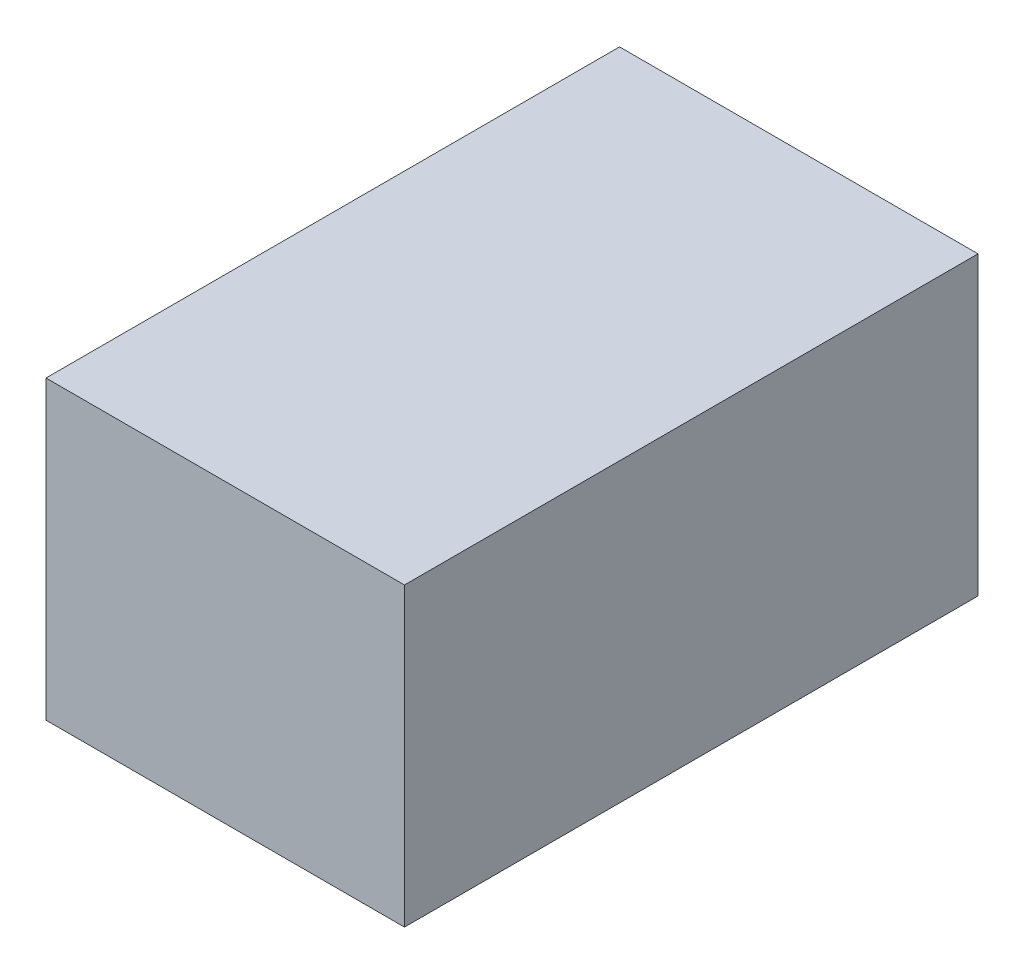
ISO-10303-21;
HEADER;
FILE_DESCRIPTION(('STEP AP214'),'2;1');
FILE_NAME('part.step','',(''),(''),'','','');
FILE_SCHEMA(('AUTOMOTIVE_DESIGN { 1 0 10303 214 1 1 1 1 }'));
ENDSEC;
DATA;
#1=APPLICATION_CONTEXT('core data for automotive mechanical design processes');
#2=APPLICATION_PROTOCOL_DEFINITION('international standard','automotive_design',2000,#1);
#3=PRODUCT_CONTEXT('',#1,'mechanical');
#4=PRODUCT('Part','Part','',(#3));
#5=PRODUCT_RELATED_PRODUCT_CATEGORY('part','',(#4));
#6=PRODUCT_DEFINITION_FORMATION('','',#4);
#7=PRODUCT_DEFINITION_CONTEXT('part definition',#1,'design');
#8=PRODUCT_DEFINITION('design','',#6,#7);
#9=PRODUCT_DEFINITION_SHAPE('','',#8);
#10=(LENGTH_UNIT() NAMED_UNIT(*) SI_UNIT(.MILLI.,.METRE.));
#11=(NAMED_UNIT(*) PLANE_ANGLE_UNIT() SI_UNIT($,.RADIAN.));
#12=(NAMED_UNIT(*) SI_UNIT($,.STERADIAN.) SOLID_ANGLE_UNIT());
#13=UNCERTAINTY_MEASURE_WITH_UNIT(LENGTH_MEASURE(1.E-05),#10,'distance_accuracy_value','');
#14=(GEOMETRIC_REPRESENTATION_CONTEXT(3) GLOBAL_UNCERTAINTY_ASSIGNED_CONTEXT((#13)) GLOBAL_UNIT_ASSIGNED_CONTEXT((#10,
#11,#12)) REPRESENTATION_CONTEXT('',''));
#15=CARTESIAN_POINT('',(0.,0.,0.));
#16=DIRECTION('',(0.,0.,1.));
#17=DIRECTION('',(1.,0.,0.));
#18=AXIS2_PLACEMENT_3D('',#15,#16,#17);
#19=CARTESIAN_POINT('',(37.5,62.,-60.));
#20=DIRECTION('',(-1.,0.,0.));
#21=DIRECTION('',(0.,0.,1.));
#22=AXIS2_PLACEMENT_3D('',#19,#20,#21);
#23=PLANE('',#22);
#24=DIRECTION('',(0.,0.,-1.));
#25=VECTOR('',#24,1.);
#26=CARTESIAN_POINT('',(37.5,0.,-60.));
#27=LINE('',#26,#25);
#28=CARTESIAN_POINT('',(37.5,0.,60.));
#29=VERTEX_POINT('',#28);
#30=CARTESIAN_POINT('',(37.5,0.,-60.));
#31=VERTEX_POINT('',#30);
#32=EDGE_CURVE('E102',#29,#31,#27,.T.);
#33=ORIENTED_EDGE('',*,*,#32,.T.);
#34=DIRECTION('',(0.,-1.,0.));
#35=VECTOR('',#34,1.);
#36=CARTESIAN_POINT('',(37.5,62.,-60.));
#37=LINE('',#36,#35);
#38=CARTESIAN_POINT('',(37.5,62.,-60.));
#39=VERTEX_POINT('',#38);
#40=EDGE_CURVE('E11',#39,#31,#37,.T.);
#41=ORIENTED_EDGE('',*,*,#40,.F.);
#42=DIRECTION('',(0.,0.,-1.));
#43=VECTOR('',#42,1.);
#44=CARTESIAN_POINT('',(37.5,62.,-60.));
#45=LINE('',#44,#43);
#46=CARTESIAN_POINT('',(37.5,62.,60.));
#47=VERTEX_POINT('',#46);
#48=EDGE_CURVE('E90',#47,#39,#45,.T.);
#49=ORIENTED_EDGE('',*,*,#48,.F.);
#50=DIRECTION('',(0.,-1.,0.));
#51=VECTOR('',#50,1.);
#52=CARTESIAN_POINT('',(37.5,62.,60.));
#53=LINE('',#52,#51);
#54=EDGE_CURVE('E98',#47,#29,#53,.T.);
#55=ORIENTED_EDGE('',*,*,#54,.T.);
#56=EDGE_LOOP('',(#33,#41,#49,#55));
#57=FACE_BOUND('',#56,.T.);
#58=ADVANCED_FACE('F39',(#57),#23,.F.);
#59=CARTESIAN_POINT('',(-37.5,62.,-60.));
#60=DIRECTION('',(0.,0.,1.));
#61=DIRECTION('',(1.,0.,0.));
#62=AXIS2_PLACEMENT_3D('',#59,#60,#61);
#63=PLANE('',#62);
#64=DIRECTION('',(-1.,0.,0.));
#65=VECTOR('',#64,1.);
#66=CARTESIAN_POINT('',(-37.5,0.,-60.));
#67=LINE('',#66,#65);
#68=CARTESIAN_POINT('',(-37.5,0.,-60.));
#69=VERTEX_POINT('',#68);
#70=EDGE_CURVE('E94',#31,#69,#67,.T.);
#71=ORIENTED_EDGE('',*,*,#70,.T.);
#72=DIRECTION('',(0.,-1.,0.));
#73=VECTOR('',#72,1.);
#74=CARTESIAN_POINT('',(-37.5,62.,-60.));
#75=LINE('',#74,#73);
#76=CARTESIAN_POINT('',(-37.5,62.,-60.));
#77=VERTEX_POINT('',#76);
#78=EDGE_CURVE('E47',#77,#69,#75,.T.);
#79=ORIENTED_EDGE('',*,*,#78,.F.);
#80=DIRECTION('',(-1.,0.,0.));
#81=VECTOR('',#80,1.);
#82=CARTESIAN_POINT('',(-37.5,62.,-60.));
#83=LINE('',#82,#81);
#84=EDGE_CURVE('E85',#39,#77,#83,.T.);
#85=ORIENTED_EDGE('',*,*,#84,.F.);
#86=ORIENTED_EDGE('',*,*,#40,.T.);
#87=EDGE_LOOP('',(#71,#79,#85,#86));
#88=FACE_BOUND('',#87,.T.);
#89=ADVANCED_FACE('F93',(#88),#63,.F.);
#90=CARTESIAN_POINT('',(-37.5,62.,-60.));
#91=DIRECTION('',(1.,0.,0.));
#92=DIRECTION('',(0.,0.,-1.));
#93=AXIS2_PLACEMENT_3D('',#90,#91,#92);
#94=PLANE('',#93);
#95=DIRECTION('',(0.,0.,1.));
#96=VECTOR('',#95,1.);
#97=CARTESIAN_POINT('',(-37.5,0.,-60.));
#98=LINE('',#97,#96);
#99=CARTESIAN_POINT('',(-37.5,0.,60.));
#100=VERTEX_POINT('',#99);
#101=EDGE_CURVE('E72',#69,#100,#98,.T.);
#102=ORIENTED_EDGE('',*,*,#101,.T.);
#103=DIRECTION('',(0.,-1.,0.));
#104=VECTOR('',#103,1.);
#105=CARTESIAN_POINT('',(-37.5,62.,60.));
#106=LINE('',#105,#104);
#107=CARTESIAN_POINT('',(-37.5,62.,60.));
#108=VERTEX_POINT('',#107);
#109=EDGE_CURVE('E95',#108,#100,#106,.T.);
#110=ORIENTED_EDGE('',*,*,#109,.F.);
#111=DIRECTION('',(0.,0.,1.));
#112=VECTOR('',#111,1.);
#113=CARTESIAN_POINT('',(-37.5,62.,-60.));
#114=LINE('',#113,#112);
#115=EDGE_CURVE('E88',#77,#108,#114,.T.);
#116=ORIENTED_EDGE('',*,*,#115,.F.);
#117=ORIENTED_EDGE('',*,*,#78,.T.);
#118=EDGE_LOOP('',(#102,#110,#116,#117));
#119=FACE_BOUND('',#118,.T.);
#120=ADVANCED_FACE('F96',(#119),#94,.F.);
#121=CARTESIAN_POINT('',(-37.5,62.,60.));
#122=DIRECTION('',(0.,0.,-1.));
#123=DIRECTION('',(-1.,0.,0.));
#124=AXIS2_PLACEMENT_3D('',#121,#122,#123);
#125=PLANE('',#124);
#126=DIRECTION('',(1.,0.,0.));
#127=VECTOR('',#126,1.);
#128=CARTESIAN_POINT('',(-37.5,0.,60.));
#129=LINE('',#128,#127);
#130=EDGE_CURVE('E78',#100,#29,#129,.T.);
#131=ORIENTED_EDGE('',*,*,#130,.T.);
#132=ORIENTED_EDGE('',*,*,#54,.F.);
#133=DIRECTION('',(1.,0.,0.));
#134=VECTOR('',#133,1.);
#135=CARTESIAN_POINT('',(-37.5,62.,60.));
#136=LINE('',#135,#134);
#137=EDGE_CURVE('E55',#108,#47,#136,.T.);
#138=ORIENTED_EDGE('',*,*,#137,.F.);
#139=ORIENTED_EDGE('',*,*,#109,.T.);
#140=EDGE_LOOP('',(#131,#132,#138,#139));
#141=FACE_BOUND('',#140,.T.);
#142=ADVANCED_FACE('F109',(#141),#125,.F.);
#143=CARTESIAN_POINT('',(0.,62.,0.));
#144=DIRECTION('',(0.,1.,0.));
#145=DIRECTION('',(0.,0.,1.));
#146=AXIS2_PLACEMENT_3D('',#143,#144,#145);
#147=PLANE('',#146);
#148=ORIENTED_EDGE('',*,*,#48,.T.);
#149=ORIENTED_EDGE('',*,*,#84,.T.);
#150=ORIENTED_EDGE('',*,*,#115,.T.);
#151=ORIENTED_EDGE('',*,*,#137,.T.);
#152=EDGE_LOOP('',(#148,#149,#150,#151));
#153=FACE_BOUND('',#152,.T.);
#154=ADVANCED_FACE('F86',(#153),#147,.T.);
#155=CARTESIAN_POINT('',(0.,0.,0.));
#156=DIRECTION('',(0.,1.,0.));
#157=DIRECTION('',(0.,0.,1.));
#158=AXIS2_PLACEMENT_3D('',#155,#156,#157);
#159=PLANE('',#158);
#160=ORIENTED_EDGE('',*,*,#32,.F.);
#161=ORIENTED_EDGE('',*,*,#130,.F.);
#162=ORIENTED_EDGE('',*,*,#101,.F.);
#163=ORIENTED_EDGE('',*,*,#70,.F.);
#164=EDGE_LOOP('',(#160,#161,#162,#163));
#165=FACE_BOUND('',#164,.T.);
#166=ADVANCED_FACE('F112',(#165),#159,.F.);
#167=CLOSED_SHELL('',(#58,#89,#120,#142,#154,#166));
#168=MANIFOLD_SOLID_BREP('B2',#167);
#169=ADVANCED_BREP_SHAPE_REPRESENTATION('',(#18,#168),#14);
#170=SHAPE_DEFINITION_REPRESENTATION(#9,#169);
ENDSEC;
END-ISO-10303-21;
